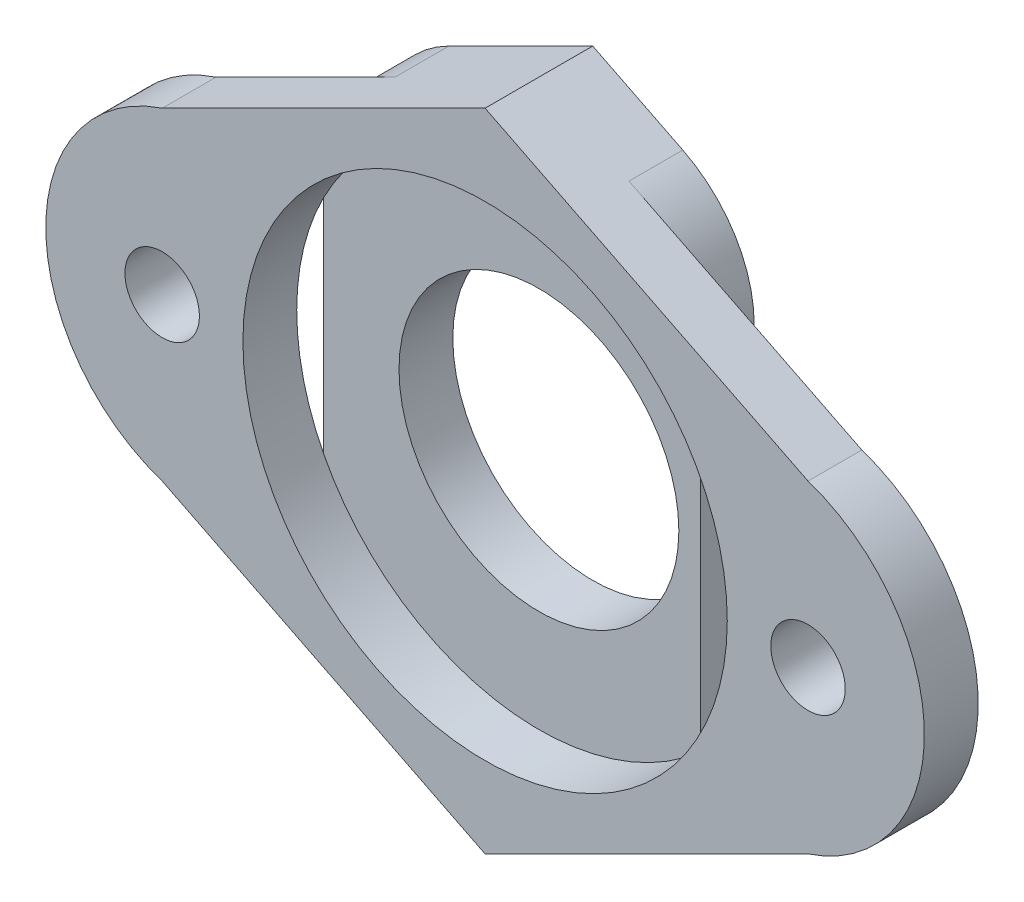
ISO-10303-21;
HEADER;
FILE_DESCRIPTION(('STEP AP214'),'2;1');
FILE_NAME('part.step','',(''),(''),'','','');
FILE_SCHEMA(('AUTOMOTIVE_DESIGN { 1 0 10303 214 1 1 1 1 }'));
ENDSEC;
DATA;
#1=APPLICATION_CONTEXT('core data for automotive mechanical design processes');
#2=APPLICATION_PROTOCOL_DEFINITION('international standard','automotive_design',2000,#1);
#3=PRODUCT_CONTEXT('',#1,'mechanical');
#4=PRODUCT('Part','Part','',(#3));
#5=PRODUCT_RELATED_PRODUCT_CATEGORY('part','',(#4));
#6=PRODUCT_DEFINITION_FORMATION('','',#4);
#7=PRODUCT_DEFINITION_CONTEXT('part definition',#1,'design');
#8=PRODUCT_DEFINITION('design','',#6,#7);
#9=PRODUCT_DEFINITION_SHAPE('','',#8);
#10=(LENGTH_UNIT() NAMED_UNIT(*) SI_UNIT(.MILLI.,.METRE.));
#11=(NAMED_UNIT(*) PLANE_ANGLE_UNIT() SI_UNIT($,.RADIAN.));
#12=(NAMED_UNIT(*) SI_UNIT($,.STERADIAN.) SOLID_ANGLE_UNIT());
#13=UNCERTAINTY_MEASURE_WITH_UNIT(LENGTH_MEASURE(1.E-05),#10,'distance_accuracy_value','');
#14=(GEOMETRIC_REPRESENTATION_CONTEXT(3) GLOBAL_UNCERTAINTY_ASSIGNED_CONTEXT((#13)) GLOBAL_UNIT_ASSIGNED_CONTEXT((#10,
#11,#12)) REPRESENTATION_CONTEXT('',''));
#15=CARTESIAN_POINT('',(0.,0.,0.));
#16=DIRECTION('',(0.,0.,1.));
#17=DIRECTION('',(1.,0.,0.));
#18=AXIS2_PLACEMENT_3D('',#15,#16,#17);
#19=CARTESIAN_POINT('',(0.,-19.05,3.175));
#20=DIRECTION('',(0.,0.,1.));
#21=DIRECTION('',(1.,0.,0.));
#22=AXIS2_PLACEMENT_3D('',#19,#20,#21);
#23=PLANE('',#22);
#24=CARTESIAN_POINT('',(0.,-19.05,3.175));
#25=DIRECTION('',(0.,0.,1.));
#26=DIRECTION('',(1.,0.,0.));
#27=AXIS2_PLACEMENT_3D('',#24,#25,#26);
#28=CIRCLE('',#27,8.255);
#29=CARTESIAN_POINT('',(8.255,-19.05,3.175));
#30=VERTEX_POINT('',#29);
#31=EDGE_CURVE('E341',#30,#30,#28,.T.);
#32=ORIENTED_EDGE('',*,*,#31,.F.);
#33=EDGE_LOOP('',(#32));
#34=FACE_BOUND('',#33,.T.);
#35=CARTESIAN_POINT('',(0.,-19.05,3.175));
#36=DIRECTION('',(0.,0.,1.));
#37=DIRECTION('',(1.,0.,0.));
#38=AXIS2_PLACEMENT_3D('',#35,#36,#37);
#39=CIRCLE('',#38,14.2875);
#40=CARTESIAN_POINT('',(-12.7,-25.595430180668,3.175));
#41=VERTEX_POINT('',#40);
#42=CARTESIAN_POINT('',(9.43796556593605,-29.7764841502799,3.175));
#43=VERTEX_POINT('',#42);
#44=EDGE_CURVE('E176',#41,#43,#39,.T.);
#45=ORIENTED_EDGE('',*,*,#44,.T.);
#46=CARTESIAN_POINT('',(1.905,-28.6280810057258,3.175));
#47=DIRECTION('',(0.,0.,1.));
#48=DIRECTION('',(1.,0.,0.));
#49=AXIS2_PLACEMENT_3D('',#46,#47,#48);
#50=CIRCLE('',#49,7.62);
#51=CARTESIAN_POINT('',(9.525,-28.6280810057258,3.175));
#52=VERTEX_POINT('',#51);
#53=EDGE_CURVE('E206',#43,#52,#50,.T.);
#54=ORIENTED_EDGE('',*,*,#53,.T.);
#55=DIRECTION('',(0.,1.,0.));
#56=VECTOR('',#55,1.);
#57=CARTESIAN_POINT('',(9.525,-4.76249999999999,3.175));
#58=LINE('',#57,#56);
#59=CARTESIAN_POINT('',(9.525,-9.4719189942742,3.175));
#60=VERTEX_POINT('',#59);
#61=EDGE_CURVE('E339',#52,#60,#58,.T.);
#62=ORIENTED_EDGE('',*,*,#61,.T.);
#63=CARTESIAN_POINT('',(1.905,-9.4719189942742,3.175));
#64=DIRECTION('',(0.,0.,1.));
#65=DIRECTION('',(1.,0.,0.));
#66=AXIS2_PLACEMENT_3D('',#63,#64,#65);
#67=CIRCLE('',#66,7.62);
#68=CARTESIAN_POINT('',(9.43796556593605,-8.32351584972012,3.175));
#69=VERTEX_POINT('',#68);
#70=EDGE_CURVE('E172',#60,#69,#67,.T.);
#71=ORIENTED_EDGE('',*,*,#70,.T.);
#72=CARTESIAN_POINT('',(-12.7,-12.504569819332,3.175));
#73=VERTEX_POINT('',#72);
#74=EDGE_CURVE('E169',#69,#73,#39,.T.);
#75=ORIENTED_EDGE('',*,*,#74,.T.);
#76=DIRECTION('',(0.,-1.,0.));
#77=VECTOR('',#76,1.);
#78=CARTESIAN_POINT('',(-12.7,-6.35,3.175));
#79=LINE('',#78,#77);
#80=EDGE_CURVE('E164',#73,#41,#79,.T.);
#81=ORIENTED_EDGE('',*,*,#80,.T.);
#82=EDGE_LOOP('',(#45,#54,#62,#71,#75,#81));
#83=FACE_BOUND('',#82,.T.);
#84=ADVANCED_FACE('F39',(#34,#83),#23,.T.);
#85=CARTESIAN_POINT('',(-15.875,-19.05,6.35));
#86=DIRECTION('',(0.,0.,-1.));
#87=DIRECTION('',(-1.,0.,0.));
#88=AXIS2_PLACEMENT_3D('',#85,#86,#87);
#89=CYLINDRICAL_SURFACE('',#88,10.0402315710346);
#90=CARTESIAN_POINT('',(-15.875,-19.05,3.175));
#91=DIRECTION('',(0.,0.,-1.));
#92=DIRECTION('',(-1.,0.,0.));
#93=AXIS2_PLACEMENT_3D('',#90,#91,#92);
#94=CIRCLE('',#93,10.0402315710346);
#95=CARTESIAN_POINT('',(-19.05,-28.575,3.175));
#96=VERTEX_POINT('',#95);
#97=CARTESIAN_POINT('',(-19.05,-9.525,3.175));
#98=VERTEX_POINT('',#97);
#99=EDGE_CURVE('E190',#96,#98,#94,.T.);
#100=ORIENTED_EDGE('',*,*,#99,.F.);
#101=DIRECTION('',(0.,0.,-1.));
#102=VECTOR('',#101,1.);
#103=CARTESIAN_POINT('',(-19.05,-28.575,6.35));
#104=LINE('',#103,#102);
#105=CARTESIAN_POINT('',(-19.05,-28.575,6.35));
#106=VERTEX_POINT('',#105);
#107=EDGE_CURVE('E301',#106,#96,#104,.T.);
#108=ORIENTED_EDGE('',*,*,#107,.F.);
#109=CARTESIAN_POINT('',(-15.875,-19.05,6.35));
#110=DIRECTION('',(0.,0.,1.));
#111=DIRECTION('',(-1.,0.,0.));
#112=AXIS2_PLACEMENT_3D('',#109,#110,#111);
#113=CIRCLE('',#112,10.0402315710346);
#114=CARTESIAN_POINT('',(-19.05,-9.525,6.35));
#115=VERTEX_POINT('',#114);
#116=EDGE_CURVE('E373',#115,#106,#113,.T.);
#117=ORIENTED_EDGE('',*,*,#116,.F.);
#118=DIRECTION('',(0.,0.,-1.));
#119=VECTOR('',#118,1.);
#120=CARTESIAN_POINT('',(-19.05,-9.525,6.35));
#121=LINE('',#120,#119);
#122=EDGE_CURVE('E305',#115,#98,#121,.T.);
#123=ORIENTED_EDGE('',*,*,#122,.T.);
#124=EDGE_LOOP('',(#100,#108,#117,#123));
#125=FACE_BOUND('',#124,.T.);
#126=ADVANCED_FACE('F405',(#125),#89,.T.);
#127=CARTESIAN_POINT('',(-19.05,-19.05,6.35));
#128=DIRECTION('',(0.,0.,1.));
#129=DIRECTION('',(1.,0.,0.));
#130=AXIS2_PLACEMENT_3D('',#127,#128,#129);
#131=CYLINDRICAL_SURFACE('',#130,2.1971);
#132=CARTESIAN_POINT('',(-19.05,-19.05,6.35));
#133=DIRECTION('',(0.,0.,1.));
#134=DIRECTION('',(1.,0.,0.));
#135=AXIS2_PLACEMENT_3D('',#132,#133,#134);
#136=CIRCLE('',#135,2.1971);
#137=CARTESIAN_POINT('',(-16.8529,-19.05,6.35));
#138=VERTEX_POINT('',#137);
#139=EDGE_CURVE('E175',#138,#138,#136,.T.);
#140=ORIENTED_EDGE('',*,*,#139,.T.);
#141=EDGE_LOOP('',(#140));
#142=FACE_BOUND('',#141,.T.);
#143=CARTESIAN_POINT('',(-19.05,-19.05,3.175));
#144=DIRECTION('',(0.,0.,-1.));
#145=DIRECTION('',(-1.,0.,0.));
#146=AXIS2_PLACEMENT_3D('',#143,#144,#145);
#147=CIRCLE('',#146,2.1971);
#148=CARTESIAN_POINT('',(-21.2471,-19.05,3.175));
#149=VERTEX_POINT('',#148);
#150=EDGE_CURVE('E163',#149,#149,#147,.F.);
#151=ORIENTED_EDGE('',*,*,#150,.F.);
#152=EDGE_LOOP('',(#151));
#153=FACE_BOUND('',#152,.T.);
#154=ADVANCED_FACE('F388',(#142,#153),#131,.F.);
#155=CARTESIAN_POINT('',(0.,0.,6.35));
#156=DIRECTION('',(-0.447213595499958,-0.894427190999916,0.));
#157=DIRECTION('',(0.894427190999916,-0.447213595499958,0.));
#158=AXIS2_PLACEMENT_3D('',#155,#156,#157);
#159=PLANE('',#158);
#160=DIRECTION('',(-0.894427190999916,0.447213595499958,0.));
#161=VECTOR('',#160,1.);
#162=CARTESIAN_POINT('',(0.,0.,3.175));
#163=LINE('',#162,#161);
#164=CARTESIAN_POINT('',(19.05,-9.52499999999999,3.175));
#165=VERTEX_POINT('',#164);
#166=CARTESIAN_POINT('',(5.31276759770968,-2.65638379885483,3.175));
#167=VERTEX_POINT('',#166);
#168=EDGE_CURVE('E196',#165,#167,#163,.T.);
#169=ORIENTED_EDGE('',*,*,#168,.T.);
#170=DIRECTION('',(0.,0.,-1.));
#171=VECTOR('',#170,1.);
#172=CARTESIAN_POINT('',(5.31276759770968,-2.65638379885483,6.35));
#173=LINE('',#172,#171);
#174=CARTESIAN_POINT('',(5.31276759770968,-2.65638379885483,0.));
#175=VERTEX_POINT('',#174);
#176=EDGE_CURVE('E225',#167,#175,#173,.T.);
#177=ORIENTED_EDGE('',*,*,#176,.T.);
#178=DIRECTION('',(-0.894427190999916,0.447213595499958,0.));
#179=VECTOR('',#178,1.);
#180=CARTESIAN_POINT('',(0.,0.,0.));
#181=LINE('',#180,#179);
#182=CARTESIAN_POINT('',(0.,0.,0.));
#183=VERTEX_POINT('',#182);
#184=EDGE_CURVE('E261',#175,#183,#181,.T.);
#185=ORIENTED_EDGE('',*,*,#184,.T.);
#186=DIRECTION('',(0.,0.,-1.));
#187=VECTOR('',#186,1.);
#188=CARTESIAN_POINT('',(0.,0.,6.35));
#189=LINE('',#188,#187);
#190=CARTESIAN_POINT('',(0.,0.,6.35));
#191=VERTEX_POINT('',#190);
#192=EDGE_CURVE('E309',#191,#183,#189,.T.);
#193=ORIENTED_EDGE('',*,*,#192,.F.);
#194=DIRECTION('',(-0.894427190999916,0.447213595499958,0.));
#195=VECTOR('',#194,1.);
#196=CARTESIAN_POINT('',(0.,0.,6.35));
#197=LINE('',#196,#195);
#198=CARTESIAN_POINT('',(19.05,-9.52499999999999,6.35));
#199=VERTEX_POINT('',#198);
#200=EDGE_CURVE('E289',#199,#191,#197,.T.);
#201=ORIENTED_EDGE('',*,*,#200,.F.);
#202=DIRECTION('',(0.,0.,-1.));
#203=VECTOR('',#202,1.);
#204=CARTESIAN_POINT('',(19.05,-9.52499999999999,6.35));
#205=LINE('',#204,#203);
#206=EDGE_CURVE('E290',#199,#165,#205,.T.);
#207=ORIENTED_EDGE('',*,*,#206,.T.);
#208=EDGE_LOOP('',(#169,#177,#185,#193,#201,#207));
#209=FACE_BOUND('',#208,.T.);
#210=ADVANCED_FACE('F259',(#209),#159,.F.);
#211=CARTESIAN_POINT('',(0.,0.,6.35));
#212=DIRECTION('',(0.447213595499958,-0.894427190999916,0.));
#213=DIRECTION('',(0.894427190999916,0.447213595499958,0.));
#214=AXIS2_PLACEMENT_3D('',#211,#212,#213);
#215=PLANE('',#214);
#216=DIRECTION('',(-0.894427190999916,-0.447213595499958,0.));
#217=VECTOR('',#216,1.);
#218=CARTESIAN_POINT('',(0.,0.,0.));
#219=LINE('',#218,#217);
#220=CARTESIAN_POINT('',(-8.48776759770968,-4.24388379885484,0.));
#221=VERTEX_POINT('',#220);
#222=EDGE_CURVE('E268',#183,#221,#219,.T.);
#223=ORIENTED_EDGE('',*,*,#222,.T.);
#224=DIRECTION('',(0.,0.,-1.));
#225=VECTOR('',#224,1.);
#226=CARTESIAN_POINT('',(-8.48776759770968,-4.24388379885484,6.35));
#227=LINE('',#226,#225);
#228=CARTESIAN_POINT('',(-8.48776759770968,-4.24388379885484,3.175));
#229=VERTEX_POINT('',#228);
#230=EDGE_CURVE('E241',#221,#229,#227,.F.);
#231=ORIENTED_EDGE('',*,*,#230,.T.);
#232=DIRECTION('',(0.894427190999916,0.447213595499958,0.));
#233=VECTOR('',#232,1.);
#234=CARTESIAN_POINT('',(0.,0.,3.175));
#235=LINE('',#234,#233);
#236=EDGE_CURVE('E184',#98,#229,#235,.T.);
#237=ORIENTED_EDGE('',*,*,#236,.F.);
#238=ORIENTED_EDGE('',*,*,#122,.F.);
#239=DIRECTION('',(-0.894427190999916,-0.447213595499958,0.));
#240=VECTOR('',#239,1.);
#241=CARTESIAN_POINT('',(0.,0.,6.35));
#242=LINE('',#241,#240);
#243=EDGE_CURVE('E378',#191,#115,#242,.T.);
#244=ORIENTED_EDGE('',*,*,#243,.F.);
#245=ORIENTED_EDGE('',*,*,#192,.T.);
#246=EDGE_LOOP('',(#223,#231,#237,#238,#244,#245));
#247=FACE_BOUND('',#246,.T.);
#248=ADVANCED_FACE('F399',(#247),#215,.F.);
#249=CARTESIAN_POINT('',(-19.05,-28.575,6.35));
#250=DIRECTION('',(0.447213595499958,0.894427190999916,0.));
#251=DIRECTION('',(-0.894427190999916,0.447213595499958,0.));
#252=AXIS2_PLACEMENT_3D('',#249,#250,#251);
#253=PLANE('',#252);
#254=DIRECTION('',(-0.894427190999916,0.447213595499958,0.));
#255=VECTOR('',#254,1.);
#256=CARTESIAN_POINT('',(-19.05,-28.575,3.175));
#257=LINE('',#256,#255);
#258=CARTESIAN_POINT('',(-8.48776759770968,-33.8561162011452,3.175));
#259=VERTEX_POINT('',#258);
#260=EDGE_CURVE('E315',#259,#96,#257,.T.);
#261=ORIENTED_EDGE('',*,*,#260,.F.);
#262=DIRECTION('',(0.,0.,-1.));
#263=VECTOR('',#262,1.);
#264=CARTESIAN_POINT('',(-8.48776759770968,-33.8561162011452,6.35));
#265=LINE('',#264,#263);
#266=CARTESIAN_POINT('',(-8.48776759770968,-33.8561162011452,0.));
#267=VERTEX_POINT('',#266);
#268=EDGE_CURVE('E218',#259,#267,#265,.T.);
#269=ORIENTED_EDGE('',*,*,#268,.T.);
#270=DIRECTION('',(0.894427190999916,-0.447213595499958,0.));
#271=VECTOR('',#270,1.);
#272=CARTESIAN_POINT('',(-19.05,-28.575,0.));
#273=LINE('',#272,#271);
#274=CARTESIAN_POINT('',(0.,-38.1,0.));
#275=VERTEX_POINT('',#274);
#276=EDGE_CURVE('E275',#267,#275,#273,.T.);
#277=ORIENTED_EDGE('',*,*,#276,.T.);
#278=DIRECTION('',(0.,0.,-1.));
#279=VECTOR('',#278,1.);
#280=CARTESIAN_POINT('',(0.,-38.1,6.35));
#281=LINE('',#280,#279);
#282=CARTESIAN_POINT('',(0.,-38.1,6.35));
#283=VERTEX_POINT('',#282);
#284=EDGE_CURVE('E297',#283,#275,#281,.T.);
#285=ORIENTED_EDGE('',*,*,#284,.F.);
#286=DIRECTION('',(0.894427190999916,-0.447213595499958,0.));
#287=VECTOR('',#286,1.);
#288=CARTESIAN_POINT('',(-19.05,-28.575,6.35));
#289=LINE('',#288,#287);
#290=EDGE_CURVE('E370',#106,#283,#289,.T.);
#291=ORIENTED_EDGE('',*,*,#290,.F.);
#292=ORIENTED_EDGE('',*,*,#107,.T.);
#293=EDGE_LOOP('',(#261,#269,#277,#285,#291,#292));
#294=FACE_BOUND('',#293,.T.);
#295=ADVANCED_FACE('F408',(#294),#253,.F.);
#296=CARTESIAN_POINT('',(0.,-38.1,6.35));
#297=DIRECTION('',(-0.447213595499958,0.894427190999916,0.));
#298=DIRECTION('',(-0.894427190999916,-0.447213595499958,0.));
#299=AXIS2_PLACEMENT_3D('',#296,#297,#298);
#300=PLANE('',#299);
#301=DIRECTION('',(0.894427190999916,0.447213595499958,0.));
#302=VECTOR('',#301,1.);
#303=CARTESIAN_POINT('',(0.,-38.1,0.));
#304=LINE('',#303,#302);
#305=CARTESIAN_POINT('',(5.31276759770968,-35.4436162011452,0.));
#306=VERTEX_POINT('',#305);
#307=EDGE_CURVE('E285',#275,#306,#304,.T.);
#308=ORIENTED_EDGE('',*,*,#307,.T.);
#309=DIRECTION('',(0.,0.,-1.));
#310=VECTOR('',#309,1.);
#311=CARTESIAN_POINT('',(5.31276759770968,-35.4436162011452,6.35));
#312=LINE('',#311,#310);
#313=CARTESIAN_POINT('',(5.31276759770968,-35.4436162011452,3.175));
#314=VERTEX_POINT('',#313);
#315=EDGE_CURVE('E232',#306,#314,#312,.F.);
#316=ORIENTED_EDGE('',*,*,#315,.T.);
#317=DIRECTION('',(0.894427190999916,0.447213595499958,0.));
#318=VECTOR('',#317,1.);
#319=CARTESIAN_POINT('',(0.,-38.1,3.175));
#320=LINE('',#319,#318);
#321=CARTESIAN_POINT('',(19.05,-28.575,3.175));
#322=VERTEX_POINT('',#321);
#323=EDGE_CURVE('E203',#314,#322,#320,.T.);
#324=ORIENTED_EDGE('',*,*,#323,.T.);
#325=DIRECTION('',(0.,0.,-1.));
#326=VECTOR('',#325,1.);
#327=CARTESIAN_POINT('',(19.05,-28.575,6.35));
#328=LINE('',#327,#326);
#329=CARTESIAN_POINT('',(19.05,-28.575,6.35));
#330=VERTEX_POINT('',#329);
#331=EDGE_CURVE('E293',#330,#322,#328,.T.);
#332=ORIENTED_EDGE('',*,*,#331,.F.);
#333=DIRECTION('',(0.894427190999916,0.447213595499958,0.));
#334=VECTOR('',#333,1.);
#335=CARTESIAN_POINT('',(0.,-38.1,6.35));
#336=LINE('',#335,#334);
#337=EDGE_CURVE('E366',#283,#330,#336,.T.);
#338=ORIENTED_EDGE('',*,*,#337,.F.);
#339=ORIENTED_EDGE('',*,*,#284,.T.);
#340=EDGE_LOOP('',(#308,#316,#324,#332,#338,#339));
#341=FACE_BOUND('',#340,.T.);
#342=ADVANCED_FACE('F333',(#341),#300,.F.);
#343=CARTESIAN_POINT('',(15.875,-19.05,6.35));
#344=DIRECTION('',(0.,0.,-1.));
#345=DIRECTION('',(-1.,0.,0.));
#346=AXIS2_PLACEMENT_3D('',#343,#344,#345);
#347=CYLINDRICAL_SURFACE('',#346,10.0402315710346);
#348=CARTESIAN_POINT('',(15.875,-19.05,3.175));
#349=DIRECTION('',(0.,0.,1.));
#350=DIRECTION('',(1.,0.,0.));
#351=AXIS2_PLACEMENT_3D('',#348,#349,#350);
#352=CIRCLE('',#351,10.0402315710346);
#353=EDGE_CURVE('E188',#322,#165,#352,.T.);
#354=ORIENTED_EDGE('',*,*,#353,.T.);
#355=ORIENTED_EDGE('',*,*,#206,.F.);
#356=CARTESIAN_POINT('',(15.875,-19.05,6.35));
#357=DIRECTION('',(0.,0.,1.));
#358=DIRECTION('',(-1.,0.,0.));
#359=AXIS2_PLACEMENT_3D('',#356,#357,#358);
#360=CIRCLE('',#359,10.0402315710346);
#361=EDGE_CURVE('E280',#330,#199,#360,.T.);
#362=ORIENTED_EDGE('',*,*,#361,.F.);
#363=ORIENTED_EDGE('',*,*,#331,.T.);
#364=EDGE_LOOP('',(#354,#355,#362,#363));
#365=FACE_BOUND('',#364,.T.);
#366=ADVANCED_FACE('F362',(#365),#347,.T.);
#367=CARTESIAN_POINT('',(15.875,-19.05,6.35));
#368=DIRECTION('',(0.,0.,-1.));
#369=DIRECTION('',(-1.,0.,0.));
#370=AXIS2_PLACEMENT_3D('',#367,#368,#369);
#371=PLANE('',#370);
#372=CARTESIAN_POINT('',(0.,-19.05,6.35));
#373=DIRECTION('',(0.,0.,1.));
#374=DIRECTION('',(1.,0.,0.));
#375=AXIS2_PLACEMENT_3D('',#372,#373,#374);
#376=CIRCLE('',#375,14.2875);
#377=CARTESIAN_POINT('',(14.2875,-19.05,6.35));
#378=VERTEX_POINT('',#377);
#379=EDGE_CURVE('E195',#378,#378,#376,.T.);
#380=ORIENTED_EDGE('',*,*,#379,.F.);
#381=EDGE_LOOP('',(#380));
#382=FACE_BOUND('',#381,.T.);
#383=ORIENTED_EDGE('',*,*,#139,.F.);
#384=EDGE_LOOP('',(#383));
#385=FACE_BOUND('',#384,.T.);
#386=CARTESIAN_POINT('',(19.05,-19.05,6.35));
#387=DIRECTION('',(0.,0.,1.));
#388=DIRECTION('',(1.,0.,0.));
#389=AXIS2_PLACEMENT_3D('',#386,#387,#388);
#390=CIRCLE('',#389,2.1971);
#391=CARTESIAN_POINT('',(21.2471,-19.05,6.35));
#392=VERTEX_POINT('',#391);
#393=EDGE_CURVE('E271',#392,#392,#390,.T.);
#394=ORIENTED_EDGE('',*,*,#393,.F.);
#395=EDGE_LOOP('',(#394));
#396=FACE_BOUND('',#395,.T.);
#397=ORIENTED_EDGE('',*,*,#200,.T.);
#398=ORIENTED_EDGE('',*,*,#243,.T.);
#399=ORIENTED_EDGE('',*,*,#116,.T.);
#400=ORIENTED_EDGE('',*,*,#290,.T.);
#401=ORIENTED_EDGE('',*,*,#337,.T.);
#402=ORIENTED_EDGE('',*,*,#361,.T.);
#403=EDGE_LOOP('',(#397,#398,#399,#400,#401,#402));
#404=FACE_BOUND('',#403,.T.);
#405=ADVANCED_FACE('F391',(#382,#385,#396,#404),#371,.F.);
#406=CARTESIAN_POINT('',(15.875,-19.05,0.));
#407=DIRECTION('',(0.,0.,-1.));
#408=DIRECTION('',(-1.,0.,0.));
#409=AXIS2_PLACEMENT_3D('',#406,#407,#408);
#410=PLANE('',#409);
#411=CARTESIAN_POINT('',(0.,-19.05,0.));
#412=DIRECTION('',(0.,0.,-1.));
#413=DIRECTION('',(-1.,0.,0.));
#414=AXIS2_PLACEMENT_3D('',#411,#412,#413);
#415=CIRCLE('',#414,8.255);
#416=CARTESIAN_POINT('',(-8.255,-19.05,0.));
#417=VERTEX_POINT('',#416);
#418=EDGE_CURVE('E348',#417,#417,#415,.T.);
#419=ORIENTED_EDGE('',*,*,#418,.F.);
#420=EDGE_LOOP('',(#419));
#421=FACE_BOUND('',#420,.T.);
#422=DIRECTION('',(0.,1.,0.));
#423=VECTOR('',#422,1.);
#424=CARTESIAN_POINT('',(9.525,-4.76249999999999,0.));
#425=LINE('',#424,#423);
#426=CARTESIAN_POINT('',(9.525,-28.6280810057258,0.));
#427=VERTEX_POINT('',#426);
#428=CARTESIAN_POINT('',(9.525,-9.4719189942742,0.));
#429=VERTEX_POINT('',#428);
#430=EDGE_CURVE('E338',#427,#429,#425,.T.);
#431=ORIENTED_EDGE('',*,*,#430,.F.);
#432=CARTESIAN_POINT('',(1.905,-28.6280810057258,0.));
#433=DIRECTION('',(0.,0.,-1.));
#434=DIRECTION('',(-1.,0.,0.));
#435=AXIS2_PLACEMENT_3D('',#432,#433,#434);
#436=CIRCLE('',#435,7.62);
#437=EDGE_CURVE('E329',#427,#306,#436,.T.);
#438=ORIENTED_EDGE('',*,*,#437,.T.);
#439=ORIENTED_EDGE('',*,*,#307,.F.);
#440=ORIENTED_EDGE('',*,*,#276,.F.);
#441=CARTESIAN_POINT('',(-5.08,-27.0405810057258,0.));
#442=DIRECTION('',(0.,0.,-1.));
#443=DIRECTION('',(-1.,0.,0.));
#444=AXIS2_PLACEMENT_3D('',#441,#442,#443);
#445=CIRCLE('',#444,7.62);
#446=CARTESIAN_POINT('',(-12.7,-27.0405810057258,0.));
#447=VERTEX_POINT('',#446);
#448=EDGE_CURVE('E321',#267,#447,#445,.T.);
#449=ORIENTED_EDGE('',*,*,#448,.T.);
#450=DIRECTION('',(0.,-1.,0.));
#451=VECTOR('',#450,1.);
#452=CARTESIAN_POINT('',(-12.7,-6.35,0.));
#453=LINE('',#452,#451);
#454=CARTESIAN_POINT('',(-12.7,-11.0594189942742,0.));
#455=VERTEX_POINT('',#454);
#456=EDGE_CURVE('E345',#455,#447,#453,.T.);
#457=ORIENTED_EDGE('',*,*,#456,.F.);
#458=CARTESIAN_POINT('',(-5.08,-11.0594189942742,0.));
#459=DIRECTION('',(0.,0.,-1.));
#460=DIRECTION('',(-1.,0.,0.));
#461=AXIS2_PLACEMENT_3D('',#458,#459,#460);
#462=CIRCLE('',#461,7.62);
#463=EDGE_CURVE('E324',#455,#221,#462,.T.);
#464=ORIENTED_EDGE('',*,*,#463,.T.);
#465=ORIENTED_EDGE('',*,*,#222,.F.);
#466=ORIENTED_EDGE('',*,*,#184,.F.);
#467=CARTESIAN_POINT('',(1.905,-9.4719189942742,0.));
#468=DIRECTION('',(0.,0.,-1.));
#469=DIRECTION('',(-1.,0.,0.));
#470=AXIS2_PLACEMENT_3D('',#467,#468,#469);
#471=CIRCLE('',#470,7.62);
#472=EDGE_CURVE('E256',#175,#429,#471,.T.);
#473=ORIENTED_EDGE('',*,*,#472,.T.);
#474=EDGE_LOOP('',(#431,#438,#439,#440,#449,#457,#464,#465,#466,#473));
#475=FACE_BOUND('',#474,.T.);
#476=ADVANCED_FACE('F265',(#421,#475),#410,.T.);
#477=CARTESIAN_POINT('',(19.05,-19.05,6.35));
#478=DIRECTION('',(0.,0.,1.));
#479=DIRECTION('',(1.,0.,0.));
#480=AXIS2_PLACEMENT_3D('',#477,#478,#479);
#481=CYLINDRICAL_SURFACE('',#480,2.1971);
#482=CARTESIAN_POINT('',(19.05,-19.05,3.175));
#483=DIRECTION('',(0.,0.,1.));
#484=DIRECTION('',(1.,0.,0.));
#485=AXIS2_PLACEMENT_3D('',#482,#483,#484);
#486=CIRCLE('',#485,2.1971);
#487=CARTESIAN_POINT('',(21.2471,-19.05,3.175));
#488=VERTEX_POINT('',#487);
#489=EDGE_CURVE('E183',#488,#488,#486,.F.);
#490=ORIENTED_EDGE('',*,*,#489,.T.);
#491=EDGE_LOOP('',(#490));
#492=FACE_BOUND('',#491,.T.);
#493=ORIENTED_EDGE('',*,*,#393,.T.);
#494=EDGE_LOOP('',(#493));
#495=FACE_BOUND('',#494,.T.);
#496=ADVANCED_FACE('F426',(#492,#495),#481,.F.);
#497=CARTESIAN_POINT('',(0.,-19.05,3.175));
#498=DIRECTION('',(0.,0.,1.));
#499=DIRECTION('',(1.,0.,0.));
#500=AXIS2_PLACEMENT_3D('',#497,#498,#499);
#501=CYLINDRICAL_SURFACE('',#500,14.2875);
#502=ORIENTED_EDGE('',*,*,#74,.F.);
#503=EDGE_CURVE('E56',#43,#69,#39,.T.);
#504=ORIENTED_EDGE('',*,*,#503,.F.);
#505=ORIENTED_EDGE('',*,*,#44,.F.);
#506=EDGE_CURVE('E155',#73,#41,#39,.T.);
#507=ORIENTED_EDGE('',*,*,#506,.F.);
#508=EDGE_LOOP('',(#502,#504,#505,#507));
#509=FACE_BOUND('',#508,.T.);
#510=ORIENTED_EDGE('',*,*,#379,.T.);
#511=EDGE_LOOP('',(#510));
#512=FACE_BOUND('',#511,.T.);
#513=ADVANCED_FACE('F180',(#509,#512),#501,.F.);
#514=CARTESIAN_POINT('',(0.,0.,3.175));
#515=DIRECTION('',(0.,0.,-1.));
#516=DIRECTION('',(-1.,0.,0.));
#517=AXIS2_PLACEMENT_3D('',#514,#515,#516);
#518=PLANE('',#517);
#519=ORIENTED_EDGE('',*,*,#150,.T.);
#520=EDGE_LOOP('',(#519));
#521=FACE_BOUND('',#520,.T.);
#522=ORIENTED_EDGE('',*,*,#506,.T.);
#523=CARTESIAN_POINT('',(-12.7,-27.0405810057258,3.175));
#524=VERTEX_POINT('',#523);
#525=EDGE_CURVE('E166',#41,#524,#79,.T.);
#526=ORIENTED_EDGE('',*,*,#525,.T.);
#527=CARTESIAN_POINT('',(-5.08,-27.0405810057258,3.175));
#528=DIRECTION('',(0.,0.,-1.));
#529=DIRECTION('',(-1.,0.,0.));
#530=AXIS2_PLACEMENT_3D('',#527,#528,#529);
#531=CIRCLE('',#530,7.62);
#532=EDGE_CURVE('E11',#524,#259,#531,.F.);
#533=ORIENTED_EDGE('',*,*,#532,.T.);
#534=ORIENTED_EDGE('',*,*,#260,.T.);
#535=ORIENTED_EDGE('',*,*,#99,.T.);
#536=ORIENTED_EDGE('',*,*,#236,.T.);
#537=CARTESIAN_POINT('',(-5.08,-11.0594189942742,3.175));
#538=DIRECTION('',(0.,0.,-1.));
#539=DIRECTION('',(-1.,0.,0.));
#540=AXIS2_PLACEMENT_3D('',#537,#538,#539);
#541=CIRCLE('',#540,7.62);
#542=CARTESIAN_POINT('',(-12.7,-11.0594189942742,3.175));
#543=VERTEX_POINT('',#542);
#544=EDGE_CURVE('E49',#229,#543,#541,.F.);
#545=ORIENTED_EDGE('',*,*,#544,.T.);
#546=EDGE_CURVE('E150',#543,#73,#79,.T.);
#547=ORIENTED_EDGE('',*,*,#546,.T.);
#548=EDGE_LOOP('',(#522,#526,#533,#534,#535,#536,#545,#547));
#549=FACE_BOUND('',#548,.T.);
#550=ADVANCED_FACE('F152',(#521,#549),#518,.T.);
#551=CARTESIAN_POINT('',(-12.7,-6.35,3.175));
#552=DIRECTION('',(1.,0.,0.));
#553=DIRECTION('',(0.,1.,0.));
#554=AXIS2_PLACEMENT_3D('',#551,#552,#553);
#555=PLANE('',#554);
#556=ORIENTED_EDGE('',*,*,#546,.F.);
#557=DIRECTION('',(0.,0.,-1.));
#558=VECTOR('',#557,1.);
#559=CARTESIAN_POINT('',(-12.7,-11.0594189942742,3.175));
#560=LINE('',#559,#558);
#561=EDGE_CURVE('E238',#543,#455,#560,.T.);
#562=ORIENTED_EDGE('',*,*,#561,.T.);
#563=ORIENTED_EDGE('',*,*,#456,.T.);
#564=DIRECTION('',(0.,0.,-1.));
#565=VECTOR('',#564,1.);
#566=CARTESIAN_POINT('',(-12.7,-27.0405810057258,3.175));
#567=LINE('',#566,#565);
#568=EDGE_CURVE('E230',#447,#524,#567,.F.);
#569=ORIENTED_EDGE('',*,*,#568,.T.);
#570=ORIENTED_EDGE('',*,*,#525,.F.);
#571=ORIENTED_EDGE('',*,*,#80,.F.);
#572=EDGE_LOOP('',(#556,#562,#563,#569,#570,#571));
#573=FACE_BOUND('',#572,.T.);
#574=ADVANCED_FACE('F178',(#573),#555,.F.);
#575=CARTESIAN_POINT('',(0.,0.,3.175));
#576=DIRECTION('',(0.,0.,1.));
#577=DIRECTION('',(1.,0.,0.));
#578=AXIS2_PLACEMENT_3D('',#575,#576,#577);
#579=PLANE('',#578);
#580=ORIENTED_EDGE('',*,*,#503,.T.);
#581=CARTESIAN_POINT('',(1.905,-9.4719189942742,3.175));
#582=DIRECTION('',(0.,0.,1.));
#583=DIRECTION('',(1.,0.,0.));
#584=AXIS2_PLACEMENT_3D('',#581,#582,#583);
#585=CIRCLE('',#584,7.62);
#586=EDGE_CURVE('E217',#69,#167,#585,.T.);
#587=ORIENTED_EDGE('',*,*,#586,.T.);
#588=ORIENTED_EDGE('',*,*,#168,.F.);
#589=ORIENTED_EDGE('',*,*,#353,.F.);
#590=ORIENTED_EDGE('',*,*,#323,.F.);
#591=CARTESIAN_POINT('',(1.905,-28.6280810057258,3.175));
#592=DIRECTION('',(0.,0.,1.));
#593=DIRECTION('',(1.,0.,0.));
#594=AXIS2_PLACEMENT_3D('',#591,#592,#593);
#595=CIRCLE('',#594,7.62);
#596=EDGE_CURVE('E209',#314,#43,#595,.T.);
#597=ORIENTED_EDGE('',*,*,#596,.T.);
#598=EDGE_LOOP('',(#580,#587,#588,#589,#590,#597));
#599=FACE_BOUND('',#598,.T.);
#600=ORIENTED_EDGE('',*,*,#489,.F.);
#601=EDGE_LOOP('',(#600));
#602=FACE_BOUND('',#601,.T.);
#603=ADVANCED_FACE('F210',(#599,#602),#579,.F.);
#604=CARTESIAN_POINT('',(9.525,-4.76249999999999,3.175));
#605=DIRECTION('',(-1.,0.,0.));
#606=DIRECTION('',(0.,-1.,0.));
#607=AXIS2_PLACEMENT_3D('',#604,#605,#606);
#608=PLANE('',#607);
#609=ORIENTED_EDGE('',*,*,#61,.F.);
#610=DIRECTION('',(0.,0.,-1.));
#611=VECTOR('',#610,1.);
#612=CARTESIAN_POINT('',(9.525,-28.6280810057258,3.175));
#613=LINE('',#612,#611);
#614=EDGE_CURVE('E223',#52,#427,#613,.T.);
#615=ORIENTED_EDGE('',*,*,#614,.T.);
#616=ORIENTED_EDGE('',*,*,#430,.T.);
#617=DIRECTION('',(0.,0.,-1.));
#618=VECTOR('',#617,1.);
#619=CARTESIAN_POINT('',(9.525,-9.4719189942742,3.175));
#620=LINE('',#619,#618);
#621=EDGE_CURVE('E312',#429,#60,#620,.F.);
#622=ORIENTED_EDGE('',*,*,#621,.T.);
#623=EDGE_LOOP('',(#609,#615,#616,#622));
#624=FACE_BOUND('',#623,.T.);
#625=ADVANCED_FACE('F337',(#624),#608,.F.);
#626=CARTESIAN_POINT('',(1.905,-28.6280810057258,3.175));
#627=DIRECTION('',(0.,0.,-1.));
#628=DIRECTION('',(-1.,0.,0.));
#629=AXIS2_PLACEMENT_3D('',#626,#627,#628);
#630=CYLINDRICAL_SURFACE('',#629,7.62);
#631=ORIENTED_EDGE('',*,*,#596,.F.);
#632=ORIENTED_EDGE('',*,*,#315,.F.);
#633=ORIENTED_EDGE('',*,*,#437,.F.);
#634=ORIENTED_EDGE('',*,*,#614,.F.);
#635=ORIENTED_EDGE('',*,*,#53,.F.);
#636=EDGE_LOOP('',(#631,#632,#633,#634,#635));
#637=FACE_BOUND('',#636,.T.);
#638=ADVANCED_FACE('F221',(#637),#630,.T.);
#639=CARTESIAN_POINT('',(1.905,-9.4719189942742,6.35));
#640=DIRECTION('',(0.,0.,-1.));
#641=DIRECTION('',(-1.,0.,0.));
#642=AXIS2_PLACEMENT_3D('',#639,#640,#641);
#643=CYLINDRICAL_SURFACE('',#642,7.62);
#644=ORIENTED_EDGE('',*,*,#70,.F.);
#645=ORIENTED_EDGE('',*,*,#621,.F.);
#646=ORIENTED_EDGE('',*,*,#472,.F.);
#647=ORIENTED_EDGE('',*,*,#176,.F.);
#648=ORIENTED_EDGE('',*,*,#586,.F.);
#649=EDGE_LOOP('',(#644,#645,#646,#647,#648));
#650=FACE_BOUND('',#649,.T.);
#651=ADVANCED_FACE('F254',(#650),#643,.T.);
#652=CARTESIAN_POINT('',(-5.08,-11.0594189942742,3.175));
#653=DIRECTION('',(0.,0.,-1.));
#654=DIRECTION('',(-1.,0.,0.));
#655=AXIS2_PLACEMENT_3D('',#652,#653,#654);
#656=CYLINDRICAL_SURFACE('',#655,7.62);
#657=ORIENTED_EDGE('',*,*,#544,.F.);
#658=ORIENTED_EDGE('',*,*,#230,.F.);
#659=ORIENTED_EDGE('',*,*,#463,.F.);
#660=ORIENTED_EDGE('',*,*,#561,.F.);
#661=EDGE_LOOP('',(#657,#658,#659,#660));
#662=FACE_BOUND('',#661,.T.);
#663=ADVANCED_FACE('F460',(#662),#656,.T.);
#664=CARTESIAN_POINT('',(-5.08,-27.0405810057258,6.35));
#665=DIRECTION('',(0.,0.,-1.));
#666=DIRECTION('',(-1.,0.,0.));
#667=AXIS2_PLACEMENT_3D('',#664,#665,#666);
#668=CYLINDRICAL_SURFACE('',#667,7.62);
#669=ORIENTED_EDGE('',*,*,#532,.F.);
#670=ORIENTED_EDGE('',*,*,#568,.F.);
#671=ORIENTED_EDGE('',*,*,#448,.F.);
#672=ORIENTED_EDGE('',*,*,#268,.F.);
#673=EDGE_LOOP('',(#669,#670,#671,#672));
#674=FACE_BOUND('',#673,.T.);
#675=ADVANCED_FACE('F41',(#674),#668,.T.);
#676=CARTESIAN_POINT('',(0.,-19.05,6.35));
#677=DIRECTION('',(0.,0.,-1.));
#678=DIRECTION('',(-1.,0.,0.));
#679=AXIS2_PLACEMENT_3D('',#676,#677,#678);
#680=CYLINDRICAL_SURFACE('',#679,8.255);
#681=ORIENTED_EDGE('',*,*,#31,.T.);
#682=EDGE_LOOP('',(#681));
#683=FACE_BOUND('',#682,.T.);
#684=ORIENTED_EDGE('',*,*,#418,.T.);
#685=EDGE_LOOP('',(#684));
#686=FACE_BOUND('',#685,.T.);
#687=ADVANCED_FACE('F423',(#683,#686),#680,.F.);
#688=CLOSED_SHELL('',(#84,#126,#154,#210,#248,#295,#342,#366,#405,#476,#496,#513,#550,#574,#603,
#625,#638,#651,#663,#675,#687));
#689=MANIFOLD_SOLID_BREP('B2',#688);
#690=ADVANCED_BREP_SHAPE_REPRESENTATION('',(#18,#689),#14);
#691=SHAPE_DEFINITION_REPRESENTATION(#9,#690);
ENDSEC;
END-ISO-10303-21;
